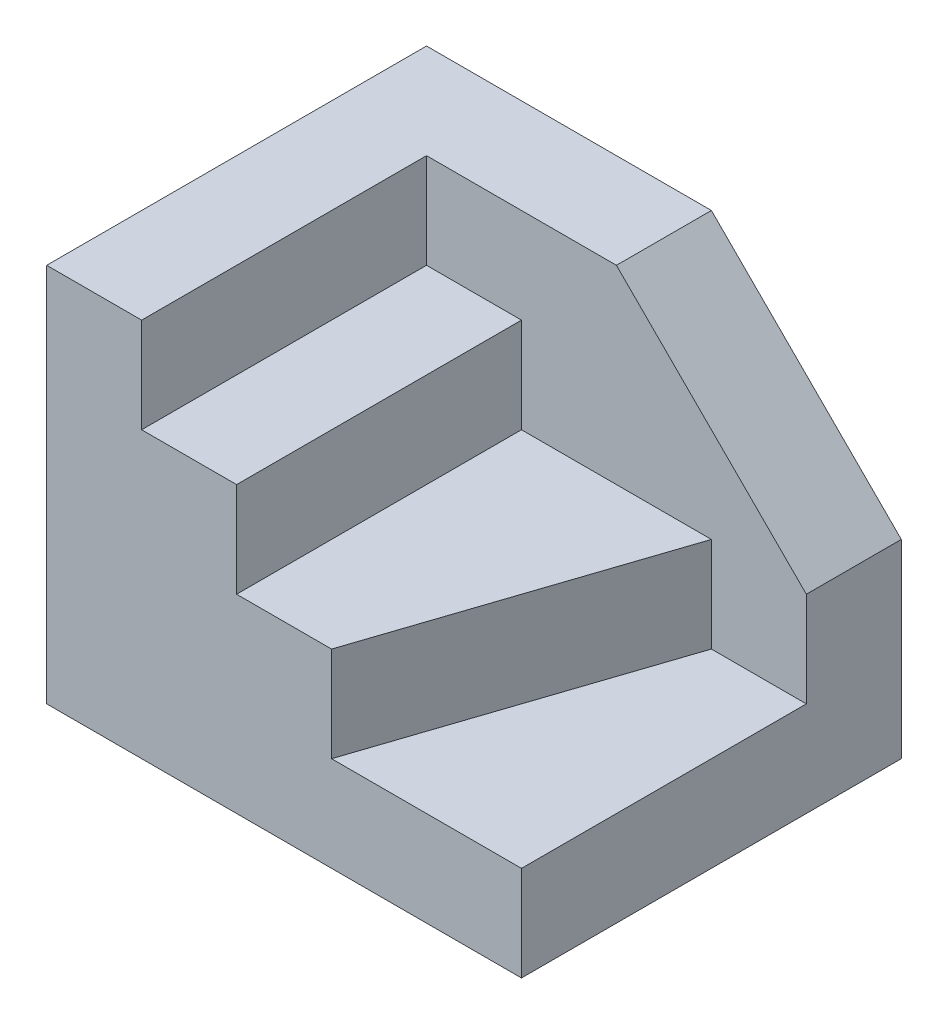
ISO-10303-21;
HEADER;
FILE_DESCRIPTION(('STEP AP214'),'2;1');
FILE_NAME('part.step','',(''),(''),'','','');
FILE_SCHEMA(('AUTOMOTIVE_DESIGN { 1 0 10303 214 1 1 1 1 }'));
ENDSEC;
DATA;
#1=APPLICATION_CONTEXT('core data for automotive mechanical design processes');
#2=APPLICATION_PROTOCOL_DEFINITION('international standard','automotive_design',2000,#1);
#3=PRODUCT_CONTEXT('',#1,'mechanical');
#4=PRODUCT('Part','Part','',(#3));
#5=PRODUCT_RELATED_PRODUCT_CATEGORY('part','',(#4));
#6=PRODUCT_DEFINITION_FORMATION('','',#4);
#7=PRODUCT_DEFINITION_CONTEXT('part definition',#1,'design');
#8=PRODUCT_DEFINITION('design','',#6,#7);
#9=PRODUCT_DEFINITION_SHAPE('','',#8);
#10=(LENGTH_UNIT() NAMED_UNIT(*) SI_UNIT(.MILLI.,.METRE.));
#11=(NAMED_UNIT(*) PLANE_ANGLE_UNIT() SI_UNIT($,.RADIAN.));
#12=(NAMED_UNIT(*) SI_UNIT($,.STERADIAN.) SOLID_ANGLE_UNIT());
#13=UNCERTAINTY_MEASURE_WITH_UNIT(LENGTH_MEASURE(1.E-05),#10,'distance_accuracy_value','');
#14=(GEOMETRIC_REPRESENTATION_CONTEXT(3) GLOBAL_UNCERTAINTY_ASSIGNED_CONTEXT((#13)) GLOBAL_UNIT_ASSIGNED_CONTEXT((#10,
#11,#12)) REPRESENTATION_CONTEXT('',''));
#15=CARTESIAN_POINT('',(0.,0.,0.));
#16=DIRECTION('',(0.,0.,1.));
#17=DIRECTION('',(1.,0.,0.));
#18=AXIS2_PLACEMENT_3D('',#15,#16,#17);
#19=CARTESIAN_POINT('',(0.,5.,0.));
#20=DIRECTION('',(0.,1.,0.));
#21=DIRECTION('',(0.,0.,1.));
#22=AXIS2_PLACEMENT_3D('',#19,#20,#21);
#23=PLANE('',#22);
#24=DIRECTION('',(-0.316227766016838,0.,0.948683298050514));
#25=VECTOR('',#24,1.);
#26=CARTESIAN_POINT('',(20.,5.,5.));
#27=LINE('',#26,#25);
#28=CARTESIAN_POINT('',(20.,5.,5.));
#29=VERTEX_POINT('',#28);
#30=CARTESIAN_POINT('',(15.,5.,20.));
#31=VERTEX_POINT('',#30);
#32=EDGE_CURVE('E50',#29,#31,#27,.T.);
#33=ORIENTED_EDGE('',*,*,#32,.T.);
#34=DIRECTION('',(1.,0.,0.));
#35=VECTOR('',#34,1.);
#36=CARTESIAN_POINT('',(0.,5.,20.));
#37=LINE('',#36,#35);
#38=CARTESIAN_POINT('',(25.,5.,20.));
#39=VERTEX_POINT('',#38);
#40=EDGE_CURVE('E202',#31,#39,#37,.T.);
#41=ORIENTED_EDGE('',*,*,#40,.T.);
#42=DIRECTION('',(0.,0.,-1.));
#43=VECTOR('',#42,1.);
#44=CARTESIAN_POINT('',(25.,5.,0.));
#45=LINE('',#44,#43);
#46=CARTESIAN_POINT('',(25.,5.,5.));
#47=VERTEX_POINT('',#46);
#48=EDGE_CURVE('E204',#39,#47,#45,.T.);
#49=ORIENTED_EDGE('',*,*,#48,.T.);
#50=DIRECTION('',(-1.,0.,0.));
#51=VECTOR('',#50,1.);
#52=CARTESIAN_POINT('',(0.,5.,5.));
#53=LINE('',#52,#51);
#54=EDGE_CURVE('E177',#47,#29,#53,.T.);
#55=ORIENTED_EDGE('',*,*,#54,.T.);
#56=EDGE_LOOP('',(#33,#41,#49,#55));
#57=FACE_BOUND('',#56,.T.);
#58=ADVANCED_FACE('F35',(#57),#23,.T.);
#59=CARTESIAN_POINT('',(0.,5.,0.));
#60=DIRECTION('',(1.,0.,0.));
#61=DIRECTION('',(0.,0.,-1.));
#62=AXIS2_PLACEMENT_3D('',#59,#60,#61);
#63=PLANE('',#62);
#64=DIRECTION('',(0.,0.,1.));
#65=VECTOR('',#64,1.);
#66=CARTESIAN_POINT('',(0.,0.,0.));
#67=LINE('',#66,#65);
#68=CARTESIAN_POINT('',(0.,0.,0.));
#69=VERTEX_POINT('',#68);
#70=CARTESIAN_POINT('',(0.,0.,20.));
#71=VERTEX_POINT('',#70);
#72=EDGE_CURVE('E201',#69,#71,#67,.T.);
#73=ORIENTED_EDGE('',*,*,#72,.T.);
#74=DIRECTION('',(0.,-1.,0.));
#75=VECTOR('',#74,1.);
#76=CARTESIAN_POINT('',(0.,5.,20.));
#77=LINE('',#76,#75);
#78=CARTESIAN_POINT('',(0.,20.,20.));
#79=VERTEX_POINT('',#78);
#80=EDGE_CURVE('E11',#79,#71,#77,.T.);
#81=ORIENTED_EDGE('',*,*,#80,.F.);
#82=DIRECTION('',(0.,0.,1.));
#83=VECTOR('',#82,1.);
#84=CARTESIAN_POINT('',(0.,20.,0.));
#85=LINE('',#84,#83);
#86=CARTESIAN_POINT('',(0.,20.,0.));
#87=VERTEX_POINT('',#86);
#88=EDGE_CURVE('E192',#87,#79,#85,.T.);
#89=ORIENTED_EDGE('',*,*,#88,.F.);
#90=DIRECTION('',(0.,-1.,0.));
#91=VECTOR('',#90,1.);
#92=CARTESIAN_POINT('',(0.,5.,0.));
#93=LINE('',#92,#91);
#94=EDGE_CURVE('E208',#87,#69,#93,.T.);
#95=ORIENTED_EDGE('',*,*,#94,.T.);
#96=EDGE_LOOP('',(#73,#81,#89,#95));
#97=FACE_BOUND('',#96,.T.);
#98=ADVANCED_FACE('F37',(#97),#63,.F.);
#99=CARTESIAN_POINT('',(0.,5.,20.));
#100=DIRECTION('',(0.,0.,-1.));
#101=DIRECTION('',(-1.,0.,0.));
#102=AXIS2_PLACEMENT_3D('',#99,#100,#101);
#103=PLANE('',#102);
#104=ORIENTED_EDGE('',*,*,#40,.F.);
#105=DIRECTION('',(0.,-1.,0.));
#106=VECTOR('',#105,1.);
#107=CARTESIAN_POINT('',(15.,10.,20.));
#108=LINE('',#107,#106);
#109=CARTESIAN_POINT('',(15.,10.,20.));
#110=VERTEX_POINT('',#109);
#111=EDGE_CURVE('E137',#110,#31,#108,.T.);
#112=ORIENTED_EDGE('',*,*,#111,.F.);
#113=DIRECTION('',(1.,0.,0.));
#114=VECTOR('',#113,1.);
#115=CARTESIAN_POINT('',(10.,10.,20.));
#116=LINE('',#115,#114);
#117=CARTESIAN_POINT('',(10.,10.,20.));
#118=VERTEX_POINT('',#117);
#119=EDGE_CURVE('E142',#118,#110,#116,.T.);
#120=ORIENTED_EDGE('',*,*,#119,.F.);
#121=DIRECTION('',(0.,1.,0.));
#122=VECTOR('',#121,1.);
#123=CARTESIAN_POINT('',(10.,5.,20.));
#124=LINE('',#123,#122);
#125=CARTESIAN_POINT('',(10.,15.,20.));
#126=VERTEX_POINT('',#125);
#127=EDGE_CURVE('E125',#118,#126,#124,.T.);
#128=ORIENTED_EDGE('',*,*,#127,.T.);
#129=DIRECTION('',(-1.,0.,0.));
#130=VECTOR('',#129,1.);
#131=CARTESIAN_POINT('',(5.,15.,20.));
#132=LINE('',#131,#130);
#133=CARTESIAN_POINT('',(5.,15.,20.));
#134=VERTEX_POINT('',#133);
#135=EDGE_CURVE('E136',#126,#134,#132,.T.);
#136=ORIENTED_EDGE('',*,*,#135,.T.);
#137=DIRECTION('',(0.,-1.,0.));
#138=VECTOR('',#137,1.);
#139=CARTESIAN_POINT('',(5.,20.,20.));
#140=LINE('',#139,#138);
#141=CARTESIAN_POINT('',(5.,20.,20.));
#142=VERTEX_POINT('',#141);
#143=EDGE_CURVE('E199',#142,#134,#140,.T.);
#144=ORIENTED_EDGE('',*,*,#143,.F.);
#145=DIRECTION('',(1.,0.,0.));
#146=VECTOR('',#145,1.);
#147=CARTESIAN_POINT('',(0.,20.,20.));
#148=LINE('',#147,#146);
#149=EDGE_CURVE('E178',#79,#142,#148,.T.);
#150=ORIENTED_EDGE('',*,*,#149,.F.);
#151=ORIENTED_EDGE('',*,*,#80,.T.);
#152=DIRECTION('',(1.,0.,0.));
#153=VECTOR('',#152,1.);
#154=CARTESIAN_POINT('',(0.,0.,20.));
#155=LINE('',#154,#153);
#156=CARTESIAN_POINT('',(25.,0.,20.));
#157=VERTEX_POINT('',#156);
#158=EDGE_CURVE('E211',#71,#157,#155,.T.);
#159=ORIENTED_EDGE('',*,*,#158,.T.);
#160=DIRECTION('',(0.,-1.,0.));
#161=VECTOR('',#160,1.);
#162=CARTESIAN_POINT('',(25.,5.,20.));
#163=LINE('',#162,#161);
#164=EDGE_CURVE('E43',#39,#157,#163,.T.);
#165=ORIENTED_EDGE('',*,*,#164,.F.);
#166=EDGE_LOOP('',(#104,#112,#120,#128,#136,#144,#150,#151,#159,#165));
#167=FACE_BOUND('',#166,.T.);
#168=ADVANCED_FACE('F145',(#167),#103,.F.);
#169=CARTESIAN_POINT('',(25.,5.,0.));
#170=DIRECTION('',(-1.,0.,0.));
#171=DIRECTION('',(0.,0.,1.));
#172=AXIS2_PLACEMENT_3D('',#169,#170,#171);
#173=PLANE('',#172);
#174=DIRECTION('',(0.,0.,-1.));
#175=VECTOR('',#174,1.);
#176=CARTESIAN_POINT('',(25.,0.,0.));
#177=LINE('',#176,#175);
#178=CARTESIAN_POINT('',(25.,0.,0.));
#179=VERTEX_POINT('',#178);
#180=EDGE_CURVE('E213',#157,#179,#177,.T.);
#181=ORIENTED_EDGE('',*,*,#180,.T.);
#182=DIRECTION('',(0.,-1.,0.));
#183=VECTOR('',#182,1.);
#184=CARTESIAN_POINT('',(25.,5.,0.));
#185=LINE('',#184,#183);
#186=CARTESIAN_POINT('',(25.,10.,0.));
#187=VERTEX_POINT('',#186);
#188=EDGE_CURVE('E218',#187,#179,#185,.T.);
#189=ORIENTED_EDGE('',*,*,#188,.F.);
#190=DIRECTION('',(0.,0.,1.));
#191=VECTOR('',#190,1.);
#192=CARTESIAN_POINT('',(25.,10.,-18.0277563773199));
#193=LINE('',#192,#191);
#194=CARTESIAN_POINT('',(25.,10.,5.));
#195=VERTEX_POINT('',#194);
#196=EDGE_CURVE('E172',#187,#195,#193,.T.);
#197=ORIENTED_EDGE('',*,*,#196,.T.);
#198=DIRECTION('',(0.,-1.,0.));
#199=VECTOR('',#198,1.);
#200=CARTESIAN_POINT('',(25.,0.,5.));
#201=LINE('',#200,#199);
#202=EDGE_CURVE('E161',#195,#47,#201,.T.);
#203=ORIENTED_EDGE('',*,*,#202,.T.);
#204=ORIENTED_EDGE('',*,*,#48,.F.);
#205=ORIENTED_EDGE('',*,*,#164,.T.);
#206=EDGE_LOOP('',(#181,#189,#197,#203,#204,#205));
#207=FACE_BOUND('',#206,.T.);
#208=ADVANCED_FACE('F225',(#207),#173,.F.);
#209=CARTESIAN_POINT('',(0.,5.,0.));
#210=DIRECTION('',(0.,0.,1.));
#211=DIRECTION('',(1.,0.,0.));
#212=AXIS2_PLACEMENT_3D('',#209,#210,#211);
#213=PLANE('',#212);
#214=DIRECTION('',(-1.,0.,0.));
#215=VECTOR('',#214,1.);
#216=CARTESIAN_POINT('',(0.,0.,0.));
#217=LINE('',#216,#215);
#218=EDGE_CURVE('E205',#179,#69,#217,.T.);
#219=ORIENTED_EDGE('',*,*,#218,.T.);
#220=ORIENTED_EDGE('',*,*,#94,.F.);
#221=DIRECTION('',(-1.,0.,0.));
#222=VECTOR('',#221,1.);
#223=CARTESIAN_POINT('',(0.,20.,0.));
#224=LINE('',#223,#222);
#225=CARTESIAN_POINT('',(15.,20.,0.));
#226=VERTEX_POINT('',#225);
#227=EDGE_CURVE('E189',#226,#87,#224,.T.);
#228=ORIENTED_EDGE('',*,*,#227,.F.);
#229=DIRECTION('',(-0.707106781186548,0.707106781186547,0.));
#230=VECTOR('',#229,1.);
#231=CARTESIAN_POINT('',(17.5,17.5,0.));
#232=LINE('',#231,#230);
#233=EDGE_CURVE('E174',#187,#226,#232,.T.);
#234=ORIENTED_EDGE('',*,*,#233,.F.);
#235=ORIENTED_EDGE('',*,*,#188,.T.);
#236=EDGE_LOOP('',(#219,#220,#228,#234,#235));
#237=FACE_BOUND('',#236,.T.);
#238=ADVANCED_FACE('F231',(#237),#213,.F.);
#239=CARTESIAN_POINT('',(0.,0.,0.));
#240=DIRECTION('',(0.,1.,0.));
#241=DIRECTION('',(0.,0.,1.));
#242=AXIS2_PLACEMENT_3D('',#239,#240,#241);
#243=PLANE('',#242);
#244=ORIENTED_EDGE('',*,*,#72,.F.);
#245=ORIENTED_EDGE('',*,*,#218,.F.);
#246=ORIENTED_EDGE('',*,*,#180,.F.);
#247=ORIENTED_EDGE('',*,*,#158,.F.);
#248=EDGE_LOOP('',(#244,#245,#246,#247));
#249=FACE_BOUND('',#248,.T.);
#250=ADVANCED_FACE('F229',(#249),#243,.F.);
#251=CARTESIAN_POINT('',(5.,20.,0.));
#252=DIRECTION('',(-1.,0.,0.));
#253=DIRECTION('',(0.,0.,1.));
#254=AXIS2_PLACEMENT_3D('',#251,#252,#253);
#255=PLANE('',#254);
#256=ORIENTED_EDGE('',*,*,#143,.T.);
#257=DIRECTION('',(0.,0.,1.));
#258=VECTOR('',#257,1.);
#259=CARTESIAN_POINT('',(5.,15.,-6.18033988749895));
#260=LINE('',#259,#258);
#261=CARTESIAN_POINT('',(5.,15.,5.));
#262=VERTEX_POINT('',#261);
#263=EDGE_CURVE('E160',#262,#134,#260,.T.);
#264=ORIENTED_EDGE('',*,*,#263,.F.);
#265=DIRECTION('',(0.,-1.,0.));
#266=VECTOR('',#265,1.);
#267=CARTESIAN_POINT('',(5.,20.,5.));
#268=LINE('',#267,#266);
#269=CARTESIAN_POINT('',(5.,20.,5.));
#270=VERTEX_POINT('',#269);
#271=EDGE_CURVE('E195',#270,#262,#268,.T.);
#272=ORIENTED_EDGE('',*,*,#271,.F.);
#273=DIRECTION('',(0.,0.,-1.));
#274=VECTOR('',#273,1.);
#275=CARTESIAN_POINT('',(5.,20.,0.));
#276=LINE('',#275,#274);
#277=EDGE_CURVE('E181',#142,#270,#276,.T.);
#278=ORIENTED_EDGE('',*,*,#277,.F.);
#279=EDGE_LOOP('',(#256,#264,#272,#278));
#280=FACE_BOUND('',#279,.T.);
#281=ADVANCED_FACE('F241',(#280),#255,.F.);
#282=CARTESIAN_POINT('',(0.,20.,5.));
#283=DIRECTION('',(0.,0.,1.));
#284=DIRECTION('',(1.,0.,0.));
#285=AXIS2_PLACEMENT_3D('',#282,#283,#284);
#286=PLANE('',#285);
#287=DIRECTION('',(0.,-1.,0.));
#288=VECTOR('',#287,1.);
#289=CARTESIAN_POINT('',(20.,10.,5.));
#290=LINE('',#289,#288);
#291=CARTESIAN_POINT('',(20.,10.,5.));
#292=VERTEX_POINT('',#291);
#293=EDGE_CURVE('E150',#292,#29,#290,.T.);
#294=ORIENTED_EDGE('',*,*,#293,.T.);
#295=ORIENTED_EDGE('',*,*,#54,.F.);
#296=ORIENTED_EDGE('',*,*,#202,.F.);
#297=DIRECTION('',(0.707106781186548,-0.707106781186547,0.));
#298=VECTOR('',#297,1.);
#299=CARTESIAN_POINT('',(17.5,17.5,5.));
#300=LINE('',#299,#298);
#301=CARTESIAN_POINT('',(15.,20.,5.));
#302=VERTEX_POINT('',#301);
#303=EDGE_CURVE('E169',#302,#195,#300,.T.);
#304=ORIENTED_EDGE('',*,*,#303,.F.);
#305=DIRECTION('',(-1.,0.,0.));
#306=VECTOR('',#305,1.);
#307=CARTESIAN_POINT('',(0.,20.,5.));
#308=LINE('',#307,#306);
#309=EDGE_CURVE('E183',#302,#270,#308,.T.);
#310=ORIENTED_EDGE('',*,*,#309,.T.);
#311=ORIENTED_EDGE('',*,*,#271,.T.);
#312=DIRECTION('',(1.,0.,0.));
#313=VECTOR('',#312,1.);
#314=CARTESIAN_POINT('',(5.,15.,5.));
#315=LINE('',#314,#313);
#316=CARTESIAN_POINT('',(10.,15.,5.));
#317=VERTEX_POINT('',#316);
#318=EDGE_CURVE('E159',#262,#317,#315,.T.);
#319=ORIENTED_EDGE('',*,*,#318,.T.);
#320=DIRECTION('',(0.,-1.,0.));
#321=VECTOR('',#320,1.);
#322=CARTESIAN_POINT('',(10.,5.,5.));
#323=LINE('',#322,#321);
#324=CARTESIAN_POINT('',(10.,10.,5.));
#325=VERTEX_POINT('',#324);
#326=EDGE_CURVE('E157',#317,#325,#323,.T.);
#327=ORIENTED_EDGE('',*,*,#326,.T.);
#328=DIRECTION('',(-1.,0.,0.));
#329=VECTOR('',#328,1.);
#330=CARTESIAN_POINT('',(20.,10.,5.));
#331=LINE('',#330,#329);
#332=EDGE_CURVE('E58',#292,#325,#331,.T.);
#333=ORIENTED_EDGE('',*,*,#332,.F.);
#334=EDGE_LOOP('',(#294,#295,#296,#304,#310,#311,#319,#327,#333));
#335=FACE_BOUND('',#334,.T.);
#336=ADVANCED_FACE('F246',(#335),#286,.T.);
#337=CARTESIAN_POINT('',(0.,20.,0.));
#338=DIRECTION('',(0.,1.,0.));
#339=DIRECTION('',(0.,0.,1.));
#340=AXIS2_PLACEMENT_3D('',#337,#338,#339);
#341=PLANE('',#340);
#342=ORIENTED_EDGE('',*,*,#149,.T.);
#343=ORIENTED_EDGE('',*,*,#277,.T.);
#344=ORIENTED_EDGE('',*,*,#309,.F.);
#345=DIRECTION('',(0.,0.,1.));
#346=VECTOR('',#345,1.);
#347=CARTESIAN_POINT('',(15.,20.,0.));
#348=LINE('',#347,#346);
#349=EDGE_CURVE('E186',#226,#302,#348,.T.);
#350=ORIENTED_EDGE('',*,*,#349,.F.);
#351=ORIENTED_EDGE('',*,*,#227,.T.);
#352=ORIENTED_EDGE('',*,*,#88,.T.);
#353=EDGE_LOOP('',(#342,#343,#344,#350,#351,#352));
#354=FACE_BOUND('',#353,.T.);
#355=ADVANCED_FACE('F237',(#354),#341,.T.);
#356=CARTESIAN_POINT('',(17.5,17.5,-18.0277563773199));
#357=DIRECTION('',(-0.707106781186547,-0.707106781186548,0.));
#358=DIRECTION('',(0.707106781186548,-0.707106781186547,0.));
#359=AXIS2_PLACEMENT_3D('',#356,#357,#358);
#360=PLANE('',#359);
#361=ORIENTED_EDGE('',*,*,#196,.F.);
#362=ORIENTED_EDGE('',*,*,#233,.T.);
#363=ORIENTED_EDGE('',*,*,#349,.T.);
#364=ORIENTED_EDGE('',*,*,#303,.T.);
#365=EDGE_LOOP('',(#361,#362,#363,#364));
#366=FACE_BOUND('',#365,.T.);
#367=ADVANCED_FACE('F251',(#366),#360,.F.);
#368=CARTESIAN_POINT('',(5.,15.,-6.18033988749895));
#369=DIRECTION('',(0.,1.,0.));
#370=DIRECTION('',(0.,0.,1.));
#371=AXIS2_PLACEMENT_3D('',#368,#369,#370);
#372=PLANE('',#371);
#373=ORIENTED_EDGE('',*,*,#318,.F.);
#374=ORIENTED_EDGE('',*,*,#263,.T.);
#375=ORIENTED_EDGE('',*,*,#135,.F.);
#376=DIRECTION('',(0.,0.,1.));
#377=VECTOR('',#376,1.);
#378=CARTESIAN_POINT('',(10.,15.,-6.18033988749895));
#379=LINE('',#378,#377);
#380=EDGE_CURVE('E131',#317,#126,#379,.T.);
#381=ORIENTED_EDGE('',*,*,#380,.F.);
#382=EDGE_LOOP('',(#373,#374,#375,#381));
#383=FACE_BOUND('',#382,.T.);
#384=ADVANCED_FACE('F245',(#383),#372,.T.);
#385=CARTESIAN_POINT('',(10.,5.,-6.18033988749895));
#386=DIRECTION('',(1.,0.,0.));
#387=DIRECTION('',(0.,0.,-1.));
#388=AXIS2_PLACEMENT_3D('',#385,#386,#387);
#389=PLANE('',#388);
#390=DIRECTION('',(0.,0.,1.));
#391=VECTOR('',#390,1.);
#392=CARTESIAN_POINT('',(10.,10.,5.));
#393=LINE('',#392,#391);
#394=EDGE_CURVE('E129',#325,#118,#393,.T.);
#395=ORIENTED_EDGE('',*,*,#394,.F.);
#396=ORIENTED_EDGE('',*,*,#326,.F.);
#397=ORIENTED_EDGE('',*,*,#380,.T.);
#398=ORIENTED_EDGE('',*,*,#127,.F.);
#399=EDGE_LOOP('',(#395,#396,#397,#398));
#400=FACE_BOUND('',#399,.T.);
#401=ADVANCED_FACE('F127',(#400),#389,.T.);
#402=CARTESIAN_POINT('',(20.,10.,5.));
#403=DIRECTION('',(0.948683298050514,0.,0.316227766016838));
#404=DIRECTION('',(0.316227766016838,0.,-0.948683298050514));
#405=AXIS2_PLACEMENT_3D('',#402,#403,#404);
#406=PLANE('',#405);
#407=ORIENTED_EDGE('',*,*,#32,.F.);
#408=ORIENTED_EDGE('',*,*,#293,.F.);
#409=DIRECTION('',(-0.316227766016838,0.,0.948683298050514));
#410=VECTOR('',#409,1.);
#411=CARTESIAN_POINT('',(20.,10.,5.));
#412=LINE('',#411,#410);
#413=EDGE_CURVE('E148',#292,#110,#412,.T.);
#414=ORIENTED_EDGE('',*,*,#413,.T.);
#415=ORIENTED_EDGE('',*,*,#111,.T.);
#416=EDGE_LOOP('',(#407,#408,#414,#415));
#417=FACE_BOUND('',#416,.T.);
#418=ADVANCED_FACE('F253',(#417),#406,.T.);
#419=CARTESIAN_POINT('',(0.,10.,0.));
#420=DIRECTION('',(0.,1.,0.));
#421=DIRECTION('',(0.,0.,1.));
#422=AXIS2_PLACEMENT_3D('',#419,#420,#421);
#423=PLANE('',#422);
#424=ORIENTED_EDGE('',*,*,#332,.T.);
#425=ORIENTED_EDGE('',*,*,#394,.T.);
#426=ORIENTED_EDGE('',*,*,#119,.T.);
#427=ORIENTED_EDGE('',*,*,#413,.F.);
#428=EDGE_LOOP('',(#424,#425,#426,#427));
#429=FACE_BOUND('',#428,.T.);
#430=ADVANCED_FACE('F140',(#429),#423,.T.);
#431=CLOSED_SHELL('',(#58,#98,#168,#208,#238,#250,#281,#336,#355,#367,#384,#401,#418,#430));
#432=MANIFOLD_SOLID_BREP('B2',#431);
#433=ADVANCED_BREP_SHAPE_REPRESENTATION('',(#18,#432),#14);
#434=SHAPE_DEFINITION_REPRESENTATION(#9,#433);
ENDSEC;
END-ISO-10303-21;
